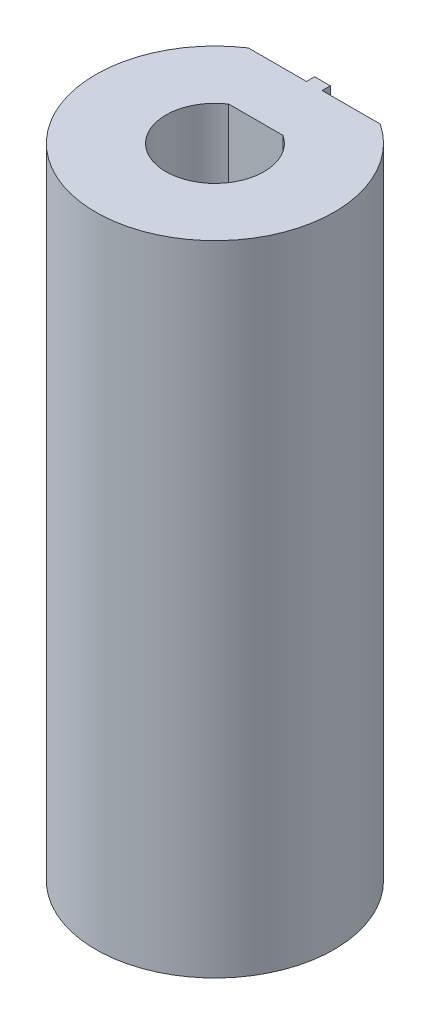
ISO-10303-21;
HEADER;
FILE_DESCRIPTION(('STEP AP214'),'2;1');
FILE_NAME('part.step','',(''),(''),'','','');
FILE_SCHEMA(('AUTOMOTIVE_DESIGN { 1 0 10303 214 1 1 1 1 }'));
ENDSEC;
DATA;
#1=APPLICATION_CONTEXT('core data for automotive mechanical design processes');
#2=APPLICATION_PROTOCOL_DEFINITION('international standard','automotive_design',2000,#1);
#3=PRODUCT_CONTEXT('',#1,'mechanical');
#4=PRODUCT('Part','Part','',(#3));
#5=PRODUCT_RELATED_PRODUCT_CATEGORY('part','',(#4));
#6=PRODUCT_DEFINITION_FORMATION('','',#4);
#7=PRODUCT_DEFINITION_CONTEXT('part definition',#1,'design');
#8=PRODUCT_DEFINITION('design','',#6,#7);
#9=PRODUCT_DEFINITION_SHAPE('','',#8);
#10=(LENGTH_UNIT() NAMED_UNIT(*) SI_UNIT(.MILLI.,.METRE.));
#11=(NAMED_UNIT(*) PLANE_ANGLE_UNIT() SI_UNIT($,.RADIAN.));
#12=(NAMED_UNIT(*) SI_UNIT($,.STERADIAN.) SOLID_ANGLE_UNIT());
#13=UNCERTAINTY_MEASURE_WITH_UNIT(LENGTH_MEASURE(1.E-05),#10,'distance_accuracy_value','');
#14=(GEOMETRIC_REPRESENTATION_CONTEXT(3) GLOBAL_UNCERTAINTY_ASSIGNED_CONTEXT((#13)) GLOBAL_UNIT_ASSIGNED_CONTEXT((#10,
#11,#12)) REPRESENTATION_CONTEXT('',''));
#15=CARTESIAN_POINT('',(0.,0.,0.));
#16=DIRECTION('',(0.,0.,1.));
#17=DIRECTION('',(1.,0.,0.));
#18=AXIS2_PLACEMENT_3D('',#15,#16,#17);
#19=CARTESIAN_POINT('',(0.,19.5,0.));
#20=DIRECTION('',(0.,-1.,0.));
#21=DIRECTION('',(0.,0.,-1.));
#22=AXIS2_PLACEMENT_3D('',#19,#20,#21);
#23=CYLINDRICAL_SURFACE('',#22,1.5);
#24=CARTESIAN_POINT('',(0.,0.,0.));
#25=DIRECTION('',(0.,1.,0.));
#26=DIRECTION('',(0.,0.,1.));
#27=AXIS2_PLACEMENT_3D('',#24,#25,#26);
#28=CIRCLE('',#27,1.5);
#29=CARTESIAN_POINT('',(-0.829156197588849,0.,-1.25));
#30=VERTEX_POINT('',#29);
#31=CARTESIAN_POINT('',(0.829156197588849,0.,-1.25));
#32=VERTEX_POINT('',#31);
#33=EDGE_CURVE('E157',#30,#32,#28,.T.);
#34=ORIENTED_EDGE('',*,*,#33,.F.);
#35=DIRECTION('',(0.,-1.,0.));
#36=VECTOR('',#35,1.);
#37=CARTESIAN_POINT('',(-0.829156197588849,19.5,-1.25));
#38=LINE('',#37,#36);
#39=CARTESIAN_POINT('',(-0.829156197588849,19.5,-1.25));
#40=VERTEX_POINT('',#39);
#41=EDGE_CURVE('E11',#40,#30,#38,.T.);
#42=ORIENTED_EDGE('',*,*,#41,.F.);
#43=CARTESIAN_POINT('',(0.,19.5,0.));
#44=DIRECTION('',(0.,1.,0.));
#45=DIRECTION('',(0.,0.,1.));
#46=AXIS2_PLACEMENT_3D('',#43,#44,#45);
#47=CIRCLE('',#46,1.5);
#48=CARTESIAN_POINT('',(0.829156197588849,19.5,-1.25));
#49=VERTEX_POINT('',#48);
#50=EDGE_CURVE('E136',#40,#49,#47,.T.);
#51=ORIENTED_EDGE('',*,*,#50,.T.);
#52=DIRECTION('',(0.,-1.,0.));
#53=VECTOR('',#52,1.);
#54=CARTESIAN_POINT('',(0.829156197588849,19.5,-1.25));
#55=LINE('',#54,#53);
#56=EDGE_CURVE('E51',#49,#32,#55,.T.);
#57=ORIENTED_EDGE('',*,*,#56,.T.);
#58=EDGE_LOOP('',(#34,#42,#51,#57));
#59=FACE_BOUND('',#58,.T.);
#60=ADVANCED_FACE('F41',(#59),#23,.F.);
#61=CARTESIAN_POINT('',(0.,19.5,-3.28378406565261));
#62=DIRECTION('',(0.,0.,1.));
#63=DIRECTION('',(1.,0.,0.));
#64=AXIS2_PLACEMENT_3D('',#61,#62,#63);
#65=PLANE('',#64);
#66=DIRECTION('',(-1.,0.,0.));
#67=VECTOR('',#66,1.);
#68=CARTESIAN_POINT('',(0.,0.,-3.28378406565261));
#69=LINE('',#68,#67);
#70=CARTESIAN_POINT('',(0.240061085654096,0.,-3.28378406565261));
#71=VERTEX_POINT('',#70);
#72=CARTESIAN_POINT('',(-0.240061085654096,0.,-3.28378406565261));
#73=VERTEX_POINT('',#72);
#74=EDGE_CURVE('E144',#71,#73,#69,.T.);
#75=ORIENTED_EDGE('',*,*,#74,.T.);
#76=DIRECTION('',(0.,-1.,0.));
#77=VECTOR('',#76,1.);
#78=CARTESIAN_POINT('',(-0.240061085654096,19.5,-3.28378406565261));
#79=LINE('',#78,#77);
#80=CARTESIAN_POINT('',(-0.240061085654096,19.5,-3.28378406565261));
#81=VERTEX_POINT('',#80);
#82=EDGE_CURVE('E45',#81,#73,#79,.T.);
#83=ORIENTED_EDGE('',*,*,#82,.F.);
#84=DIRECTION('',(-1.,0.,0.));
#85=VECTOR('',#84,1.);
#86=CARTESIAN_POINT('',(0.,19.5,-3.28378406565261));
#87=LINE('',#86,#85);
#88=CARTESIAN_POINT('',(0.240061085654096,19.5,-3.28378406565261));
#89=VERTEX_POINT('',#88);
#90=EDGE_CURVE('E128',#89,#81,#87,.T.);
#91=ORIENTED_EDGE('',*,*,#90,.F.);
#92=DIRECTION('',(0.,-1.,0.));
#93=VECTOR('',#92,1.);
#94=CARTESIAN_POINT('',(0.240061085654096,19.5,-3.28378406565261));
#95=LINE('',#94,#93);
#96=EDGE_CURVE('E115',#89,#71,#95,.T.);
#97=ORIENTED_EDGE('',*,*,#96,.T.);
#98=EDGE_LOOP('',(#75,#83,#91,#97));
#99=FACE_BOUND('',#98,.T.);
#100=ADVANCED_FACE('F43',(#99),#65,.F.);
#101=CARTESIAN_POINT('',(-0.240061085654096,19.5,0.));
#102=DIRECTION('',(1.,0.,0.));
#103=DIRECTION('',(0.,0.,-1.));
#104=AXIS2_PLACEMENT_3D('',#101,#102,#103);
#105=PLANE('',#104);
#106=DIRECTION('',(0.,0.,1.));
#107=VECTOR('',#106,1.);
#108=CARTESIAN_POINT('',(-0.240061085654096,0.,0.));
#109=LINE('',#108,#107);
#110=CARTESIAN_POINT('',(-0.240061085654096,0.,-3.03378406565261));
#111=VERTEX_POINT('',#110);
#112=EDGE_CURVE('E146',#73,#111,#109,.T.);
#113=ORIENTED_EDGE('',*,*,#112,.T.);
#114=DIRECTION('',(0.,-1.,0.));
#115=VECTOR('',#114,1.);
#116=CARTESIAN_POINT('',(-0.240061085654096,19.5,-3.03378406565261));
#117=LINE('',#116,#115);
#118=CARTESIAN_POINT('',(-0.240061085654096,19.5,-3.03378406565261));
#119=VERTEX_POINT('',#118);
#120=EDGE_CURVE('E167',#119,#111,#117,.T.);
#121=ORIENTED_EDGE('',*,*,#120,.F.);
#122=DIRECTION('',(0.,0.,1.));
#123=VECTOR('',#122,1.);
#124=CARTESIAN_POINT('',(-0.240061085654096,19.5,0.));
#125=LINE('',#124,#123);
#126=EDGE_CURVE('E99',#81,#119,#125,.T.);
#127=ORIENTED_EDGE('',*,*,#126,.F.);
#128=ORIENTED_EDGE('',*,*,#82,.T.);
#129=EDGE_LOOP('',(#113,#121,#127,#128));
#130=FACE_BOUND('',#129,.T.);
#131=ADVANCED_FACE('F172',(#130),#105,.F.);
#132=CARTESIAN_POINT('',(0.,19.5,-3.03378406565261));
#133=DIRECTION('',(0.,0.,1.));
#134=DIRECTION('',(1.,0.,0.));
#135=AXIS2_PLACEMENT_3D('',#132,#133,#134);
#136=PLANE('',#135);
#137=DIRECTION('',(-1.,0.,0.));
#138=VECTOR('',#137,1.);
#139=CARTESIAN_POINT('',(0.,0.,-3.03378406565261));
#140=LINE('',#139,#138);
#141=CARTESIAN_POINT('',(-2.01238468814573,0.,-3.03378406565261));
#142=VERTEX_POINT('',#141);
#143=EDGE_CURVE('E148',#111,#142,#140,.T.);
#144=ORIENTED_EDGE('',*,*,#143,.T.);
#145=DIRECTION('',(0.,-1.,0.));
#146=VECTOR('',#145,1.);
#147=CARTESIAN_POINT('',(-2.01238468814573,19.5,-3.03378406565261));
#148=LINE('',#147,#146);
#149=CARTESIAN_POINT('',(-2.01238468814573,19.5,-3.03378406565261));
#150=VERTEX_POINT('',#149);
#151=EDGE_CURVE('E165',#150,#142,#148,.T.);
#152=ORIENTED_EDGE('',*,*,#151,.F.);
#153=DIRECTION('',(-1.,0.,0.));
#154=VECTOR('',#153,1.);
#155=CARTESIAN_POINT('',(0.,19.5,-3.03378406565261));
#156=LINE('',#155,#154);
#157=EDGE_CURVE('E183',#119,#150,#156,.T.);
#158=ORIENTED_EDGE('',*,*,#157,.F.);
#159=ORIENTED_EDGE('',*,*,#120,.T.);
#160=EDGE_LOOP('',(#144,#152,#158,#159));
#161=FACE_BOUND('',#160,.T.);
#162=ADVANCED_FACE('F178',(#161),#136,.F.);
#163=CARTESIAN_POINT('',(0.,19.5,0.));
#164=DIRECTION('',(0.,-1.,0.));
#165=DIRECTION('',(0.,0.,-1.));
#166=AXIS2_PLACEMENT_3D('',#163,#164,#165);
#167=CYLINDRICAL_SURFACE('',#166,3.64054087878313);
#168=CARTESIAN_POINT('',(0.,0.,0.));
#169=DIRECTION('',(0.,1.,0.));
#170=DIRECTION('',(0.,0.,1.));
#171=AXIS2_PLACEMENT_3D('',#168,#169,#170);
#172=CIRCLE('',#171,3.64054087878313);
#173=CARTESIAN_POINT('',(2.01238468814573,0.,-3.03378406565261));
#174=VERTEX_POINT('',#173);
#175=EDGE_CURVE('E150',#142,#174,#172,.T.);
#176=ORIENTED_EDGE('',*,*,#175,.T.);
#177=DIRECTION('',(0.,-1.,0.));
#178=VECTOR('',#177,1.);
#179=CARTESIAN_POINT('',(2.01238468814573,19.5,-3.03378406565261));
#180=LINE('',#179,#178);
#181=CARTESIAN_POINT('',(2.01238468814573,19.5,-3.03378406565261));
#182=VERTEX_POINT('',#181);
#183=EDGE_CURVE('E163',#182,#174,#180,.T.);
#184=ORIENTED_EDGE('',*,*,#183,.F.);
#185=CARTESIAN_POINT('',(0.,19.5,0.));
#186=DIRECTION('',(0.,1.,0.));
#187=DIRECTION('',(0.,0.,1.));
#188=AXIS2_PLACEMENT_3D('',#185,#186,#187);
#189=CIRCLE('',#188,3.64054087878313);
#190=EDGE_CURVE('E139',#150,#182,#189,.T.);
#191=ORIENTED_EDGE('',*,*,#190,.F.);
#192=ORIENTED_EDGE('',*,*,#151,.T.);
#193=EDGE_LOOP('',(#176,#184,#191,#192));
#194=FACE_BOUND('',#193,.T.);
#195=ADVANCED_FACE('F181',(#194),#167,.T.);
#196=CARTESIAN_POINT('',(0.,19.5,-3.03378406565261));
#197=DIRECTION('',(0.,0.,-1.));
#198=DIRECTION('',(-1.,0.,0.));
#199=AXIS2_PLACEMENT_3D('',#196,#197,#198);
#200=PLANE('',#199);
#201=DIRECTION('',(1.,0.,0.));
#202=VECTOR('',#201,1.);
#203=CARTESIAN_POINT('',(0.,0.,-3.03378406565261));
#204=LINE('',#203,#202);
#205=CARTESIAN_POINT('',(0.240061085654096,0.,-3.03378406565261));
#206=VERTEX_POINT('',#205);
#207=EDGE_CURVE('E153',#206,#174,#204,.T.);
#208=ORIENTED_EDGE('',*,*,#207,.F.);
#209=DIRECTION('',(0.,-1.,0.));
#210=VECTOR('',#209,1.);
#211=CARTESIAN_POINT('',(0.240061085654096,19.5,-3.03378406565261));
#212=LINE('',#211,#210);
#213=CARTESIAN_POINT('',(0.240061085654096,19.5,-3.03378406565261));
#214=VERTEX_POINT('',#213);
#215=EDGE_CURVE('E125',#214,#206,#212,.T.);
#216=ORIENTED_EDGE('',*,*,#215,.F.);
#217=DIRECTION('',(1.,0.,0.));
#218=VECTOR('',#217,1.);
#219=CARTESIAN_POINT('',(0.,19.5,-3.03378406565261));
#220=LINE('',#219,#218);
#221=EDGE_CURVE('E135',#214,#182,#220,.T.);
#222=ORIENTED_EDGE('',*,*,#221,.T.);
#223=ORIENTED_EDGE('',*,*,#183,.T.);
#224=EDGE_LOOP('',(#208,#216,#222,#223));
#225=FACE_BOUND('',#224,.T.);
#226=ADVANCED_FACE('F188',(#225),#200,.T.);
#227=CARTESIAN_POINT('',(0.240061085654096,19.5,0.));
#228=DIRECTION('',(1.,0.,0.));
#229=DIRECTION('',(0.,0.,-1.));
#230=AXIS2_PLACEMENT_3D('',#227,#228,#229);
#231=PLANE('',#230);
#232=DIRECTION('',(0.,0.,1.));
#233=VECTOR('',#232,1.);
#234=CARTESIAN_POINT('',(0.240061085654096,0.,0.));
#235=LINE('',#234,#233);
#236=EDGE_CURVE('E121',#71,#206,#235,.T.);
#237=ORIENTED_EDGE('',*,*,#236,.F.);
#238=ORIENTED_EDGE('',*,*,#96,.F.);
#239=DIRECTION('',(0.,0.,1.));
#240=VECTOR('',#239,1.);
#241=CARTESIAN_POINT('',(0.240061085654096,19.5,0.));
#242=LINE('',#241,#240);
#243=EDGE_CURVE('E119',#89,#214,#242,.T.);
#244=ORIENTED_EDGE('',*,*,#243,.T.);
#245=ORIENTED_EDGE('',*,*,#215,.T.);
#246=EDGE_LOOP('',(#237,#238,#244,#245));
#247=FACE_BOUND('',#246,.T.);
#248=ADVANCED_FACE('F117',(#247),#231,.T.);
#249=CARTESIAN_POINT('',(0.,19.5,-1.25));
#250=DIRECTION('',(0.,0.,-1.));
#251=DIRECTION('',(-1.,0.,0.));
#252=AXIS2_PLACEMENT_3D('',#249,#250,#251);
#253=PLANE('',#252);
#254=DIRECTION('',(1.,0.,0.));
#255=VECTOR('',#254,1.);
#256=CARTESIAN_POINT('',(0.,0.,-1.25));
#257=LINE('',#256,#255);
#258=EDGE_CURVE('E130',#30,#32,#257,.T.);
#259=ORIENTED_EDGE('',*,*,#258,.T.);
#260=ORIENTED_EDGE('',*,*,#56,.F.);
#261=DIRECTION('',(1.,0.,0.));
#262=VECTOR('',#261,1.);
#263=CARTESIAN_POINT('',(0.,19.5,-1.25));
#264=LINE('',#263,#262);
#265=EDGE_CURVE('E59',#40,#49,#264,.T.);
#266=ORIENTED_EDGE('',*,*,#265,.F.);
#267=ORIENTED_EDGE('',*,*,#41,.T.);
#268=EDGE_LOOP('',(#259,#260,#266,#267));
#269=FACE_BOUND('',#268,.T.);
#270=ADVANCED_FACE('F195',(#269),#253,.F.);
#271=CARTESIAN_POINT('',(0.,19.5,0.));
#272=DIRECTION('',(0.,1.,0.));
#273=DIRECTION('',(0.,0.,1.));
#274=AXIS2_PLACEMENT_3D('',#271,#272,#273);
#275=PLANE('',#274);
#276=ORIENTED_EDGE('',*,*,#90,.T.);
#277=ORIENTED_EDGE('',*,*,#126,.T.);
#278=ORIENTED_EDGE('',*,*,#157,.T.);
#279=ORIENTED_EDGE('',*,*,#190,.T.);
#280=ORIENTED_EDGE('',*,*,#221,.F.);
#281=ORIENTED_EDGE('',*,*,#243,.F.);
#282=EDGE_LOOP('',(#276,#277,#278,#279,#280,#281));
#283=FACE_BOUND('',#282,.T.);
#284=ORIENTED_EDGE('',*,*,#50,.F.);
#285=ORIENTED_EDGE('',*,*,#265,.T.);
#286=EDGE_LOOP('',(#284,#285));
#287=FACE_BOUND('',#286,.T.);
#288=ADVANCED_FACE('F133',(#283,#287),#275,.T.);
#289=CARTESIAN_POINT('',(0.,0.,0.));
#290=DIRECTION('',(0.,1.,0.));
#291=DIRECTION('',(0.,0.,1.));
#292=AXIS2_PLACEMENT_3D('',#289,#290,#291);
#293=PLANE('',#292);
#294=ORIENTED_EDGE('',*,*,#74,.F.);
#295=ORIENTED_EDGE('',*,*,#236,.T.);
#296=ORIENTED_EDGE('',*,*,#207,.T.);
#297=ORIENTED_EDGE('',*,*,#175,.F.);
#298=ORIENTED_EDGE('',*,*,#143,.F.);
#299=ORIENTED_EDGE('',*,*,#112,.F.);
#300=EDGE_LOOP('',(#294,#295,#296,#297,#298,#299));
#301=FACE_BOUND('',#300,.T.);
#302=ORIENTED_EDGE('',*,*,#33,.T.);
#303=ORIENTED_EDGE('',*,*,#258,.F.);
#304=EDGE_LOOP('',(#302,#303));
#305=FACE_BOUND('',#304,.T.);
#306=ADVANCED_FACE('F174',(#301,#305),#293,.F.);
#307=CLOSED_SHELL('',(#60,#100,#131,#162,#195,#226,#248,#270,#288,#306));
#308=MANIFOLD_SOLID_BREP('B2',#307);
#309=ADVANCED_BREP_SHAPE_REPRESENTATION('',(#18,#308),#14);
#310=SHAPE_DEFINITION_REPRESENTATION(#9,#309);
ENDSEC;
END-ISO-10303-21;
